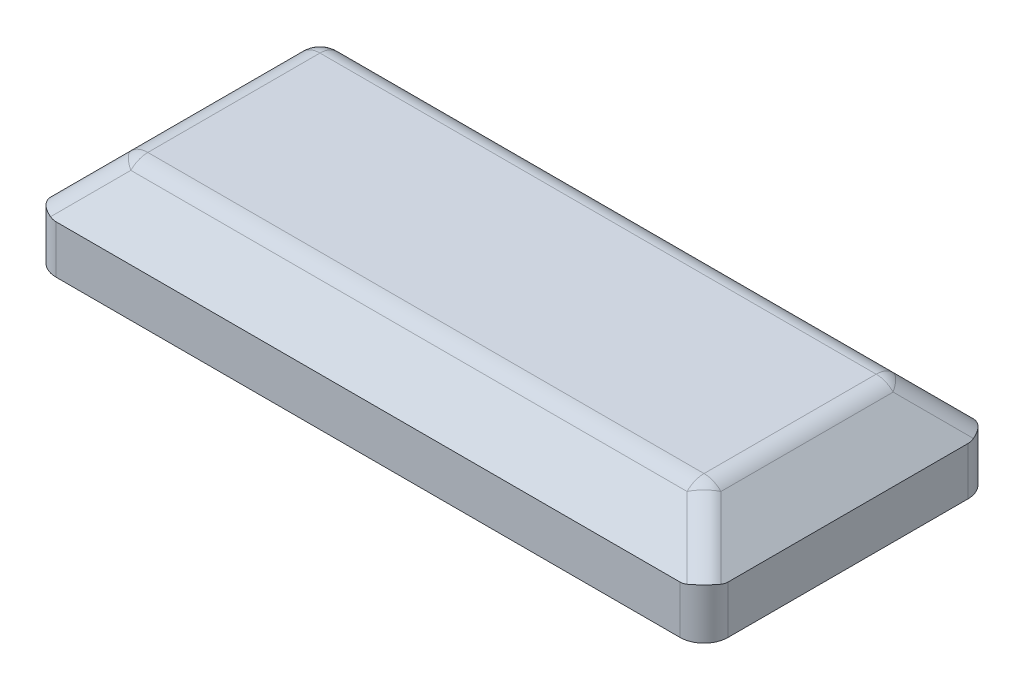
ISO-10303-21;
HEADER;
FILE_DESCRIPTION(('STEP AP214'),'2;1');
FILE_NAME('part.step','',(''),(''),'','','');
FILE_SCHEMA(('AUTOMOTIVE_DESIGN { 1 0 10303 214 1 1 1 1 }'));
ENDSEC;
DATA;
#1=APPLICATION_CONTEXT('core data for automotive mechanical design processes');
#2=APPLICATION_PROTOCOL_DEFINITION('international standard','automotive_design',2000,#1);
#3=PRODUCT_CONTEXT('',#1,'mechanical');
#4=PRODUCT('Part','Part','',(#3));
#5=PRODUCT_RELATED_PRODUCT_CATEGORY('part','',(#4));
#6=PRODUCT_DEFINITION_FORMATION('','',#4);
#7=PRODUCT_DEFINITION_CONTEXT('part definition',#1,'design');
#8=PRODUCT_DEFINITION('design','',#6,#7);
#9=PRODUCT_DEFINITION_SHAPE('','',#8);
#10=(LENGTH_UNIT() NAMED_UNIT(*) SI_UNIT(.MILLI.,.METRE.));
#11=(NAMED_UNIT(*) PLANE_ANGLE_UNIT() SI_UNIT($,.RADIAN.));
#12=(NAMED_UNIT(*) SI_UNIT($,.STERADIAN.) SOLID_ANGLE_UNIT());
#13=UNCERTAINTY_MEASURE_WITH_UNIT(LENGTH_MEASURE(1.E-05),#10,'distance_accuracy_value','');
#14=(GEOMETRIC_REPRESENTATION_CONTEXT(3) GLOBAL_UNCERTAINTY_ASSIGNED_CONTEXT((#13)) GLOBAL_UNIT_ASSIGNED_CONTEXT((#10,
#11,#12)) REPRESENTATION_CONTEXT('',''));
#15=CARTESIAN_POINT('',(0.,0.,0.));
#16=DIRECTION('',(0.,0.,1.));
#17=DIRECTION('',(1.,0.,0.));
#18=AXIS2_PLACEMENT_3D('',#15,#16,#17);
#19=CARTESIAN_POINT('',(70.,10.,30.));
#20=DIRECTION('',(-1.,0.,0.));
#21=DIRECTION('',(0.,0.,1.));
#22=AXIS2_PLACEMENT_3D('',#19,#20,#21);
#23=PLANE('',#22);
#24=DIRECTION('',(0.,0.,-1.));
#25=VECTOR('',#24,1.);
#26=CARTESIAN_POINT('',(70.,0.,30.));
#27=LINE('',#26,#25);
#28=CARTESIAN_POINT('',(70.,0.,25.));
#29=VERTEX_POINT('',#28);
#30=CARTESIAN_POINT('',(70.,0.,-25.));
#31=VERTEX_POINT('',#30);
#32=EDGE_CURVE('E298',#29,#31,#27,.T.);
#33=ORIENTED_EDGE('',*,*,#32,.T.);
#34=DIRECTION('',(0.,-1.,0.));
#35=VECTOR('',#34,1.);
#36=CARTESIAN_POINT('',(70.,10.,-25.));
#37=LINE('',#36,#35);
#38=CARTESIAN_POINT('',(70.,10.,-25.));
#39=VERTEX_POINT('',#38);
#40=EDGE_CURVE('E260',#31,#39,#37,.F.);
#41=ORIENTED_EDGE('',*,*,#40,.T.);
#42=DIRECTION('',(0.,0.,-1.));
#43=VECTOR('',#42,1.);
#44=CARTESIAN_POINT('',(70.,10.,30.));
#45=LINE('',#44,#43);
#46=CARTESIAN_POINT('',(70.,10.,25.));
#47=VERTEX_POINT('',#46);
#48=EDGE_CURVE('E318',#47,#39,#45,.T.);
#49=ORIENTED_EDGE('',*,*,#48,.F.);
#50=DIRECTION('',(0.,-1.,0.));
#51=VECTOR('',#50,1.);
#52=CARTESIAN_POINT('',(70.,10.,25.));
#53=LINE('',#52,#51);
#54=EDGE_CURVE('E258',#47,#29,#53,.T.);
#55=ORIENTED_EDGE('',*,*,#54,.T.);
#56=EDGE_LOOP('',(#33,#41,#49,#55));
#57=FACE_BOUND('',#56,.T.);
#58=ADVANCED_FACE('F37',(#57),#23,.F.);
#59=CARTESIAN_POINT('',(-70.,10.,-30.));
#60=DIRECTION('',(0.,0.,1.));
#61=DIRECTION('',(1.,0.,0.));
#62=AXIS2_PLACEMENT_3D('',#59,#60,#61);
#63=PLANE('',#62);
#64=DIRECTION('',(-1.,0.,0.));
#65=VECTOR('',#64,1.);
#66=CARTESIAN_POINT('',(-70.,0.,-30.));
#67=LINE('',#66,#65);
#68=CARTESIAN_POINT('',(65.,0.,-30.));
#69=VERTEX_POINT('',#68);
#70=CARTESIAN_POINT('',(-65.,0.,-30.));
#71=VERTEX_POINT('',#70);
#72=EDGE_CURVE('E304',#69,#71,#67,.T.);
#73=ORIENTED_EDGE('',*,*,#72,.T.);
#74=DIRECTION('',(0.,-1.,0.));
#75=VECTOR('',#74,1.);
#76=CARTESIAN_POINT('',(-65.,10.,-30.));
#77=LINE('',#76,#75);
#78=CARTESIAN_POINT('',(-65.,10.,-30.));
#79=VERTEX_POINT('',#78);
#80=EDGE_CURVE('E256',#71,#79,#77,.F.);
#81=ORIENTED_EDGE('',*,*,#80,.T.);
#82=DIRECTION('',(-1.,0.,0.));
#83=VECTOR('',#82,1.);
#84=CARTESIAN_POINT('',(-70.,10.,-30.));
#85=LINE('',#84,#83);
#86=CARTESIAN_POINT('',(65.,10.,-30.));
#87=VERTEX_POINT('',#86);
#88=EDGE_CURVE('E372',#87,#79,#85,.T.);
#89=ORIENTED_EDGE('',*,*,#88,.F.);
#90=DIRECTION('',(0.,-1.,0.));
#91=VECTOR('',#90,1.);
#92=CARTESIAN_POINT('',(65.,10.,-30.));
#93=LINE('',#92,#91);
#94=EDGE_CURVE('E61',#87,#69,#93,.T.);
#95=ORIENTED_EDGE('',*,*,#94,.T.);
#96=EDGE_LOOP('',(#73,#81,#89,#95));
#97=FACE_BOUND('',#96,.T.);
#98=ADVANCED_FACE('F400',(#97),#63,.F.);
#99=CARTESIAN_POINT('',(-70.,10.,30.));
#100=DIRECTION('',(1.,0.,0.));
#101=DIRECTION('',(0.,0.,-1.));
#102=AXIS2_PLACEMENT_3D('',#99,#100,#101);
#103=PLANE('',#102);
#104=DIRECTION('',(0.,0.,1.));
#105=VECTOR('',#104,1.);
#106=CARTESIAN_POINT('',(-70.,10.,30.));
#107=LINE('',#106,#105);
#108=CARTESIAN_POINT('',(-70.,10.,-25.));
#109=VERTEX_POINT('',#108);
#110=CARTESIAN_POINT('',(-70.,10.,25.));
#111=VERTEX_POINT('',#110);
#112=EDGE_CURVE('E371',#109,#111,#107,.T.);
#113=ORIENTED_EDGE('',*,*,#112,.F.);
#114=DIRECTION('',(0.,-1.,0.));
#115=VECTOR('',#114,1.);
#116=CARTESIAN_POINT('',(-70.,10.,-25.));
#117=LINE('',#116,#115);
#118=CARTESIAN_POINT('',(-70.,0.,-25.));
#119=VERTEX_POINT('',#118);
#120=EDGE_CURVE('E246',#109,#119,#117,.T.);
#121=ORIENTED_EDGE('',*,*,#120,.T.);
#122=DIRECTION('',(0.,0.,1.));
#123=VECTOR('',#122,1.);
#124=CARTESIAN_POINT('',(-70.,0.,30.));
#125=LINE('',#124,#123);
#126=CARTESIAN_POINT('',(-70.,0.,25.));
#127=VERTEX_POINT('',#126);
#128=EDGE_CURVE('E309',#119,#127,#125,.T.);
#129=ORIENTED_EDGE('',*,*,#128,.T.);
#130=DIRECTION('',(0.,-1.,0.));
#131=VECTOR('',#130,1.);
#132=CARTESIAN_POINT('',(-70.,10.,25.));
#133=LINE('',#132,#131);
#134=EDGE_CURVE('E244',#127,#111,#133,.F.);
#135=ORIENTED_EDGE('',*,*,#134,.T.);
#136=EDGE_LOOP('',(#113,#121,#129,#135));
#137=FACE_BOUND('',#136,.T.);
#138=ADVANCED_FACE('F405',(#137),#103,.F.);
#139=CARTESIAN_POINT('',(-70.,10.,30.));
#140=DIRECTION('',(0.,0.,-1.));
#141=DIRECTION('',(-1.,0.,0.));
#142=AXIS2_PLACEMENT_3D('',#139,#140,#141);
#143=PLANE('',#142);
#144=DIRECTION('',(1.,0.,0.));
#145=VECTOR('',#144,1.);
#146=CARTESIAN_POINT('',(-70.,0.,30.));
#147=LINE('',#146,#145);
#148=CARTESIAN_POINT('',(-65.,0.,30.));
#149=VERTEX_POINT('',#148);
#150=CARTESIAN_POINT('',(65.,0.,30.));
#151=VERTEX_POINT('',#150);
#152=EDGE_CURVE('E316',#149,#151,#147,.T.);
#153=ORIENTED_EDGE('',*,*,#152,.T.);
#154=DIRECTION('',(0.,-1.,0.));
#155=VECTOR('',#154,1.);
#156=CARTESIAN_POINT('',(65.,10.,30.));
#157=LINE('',#156,#155);
#158=CARTESIAN_POINT('',(65.,10.,30.));
#159=VERTEX_POINT('',#158);
#160=EDGE_CURVE('E11',#151,#159,#157,.F.);
#161=ORIENTED_EDGE('',*,*,#160,.T.);
#162=DIRECTION('',(1.,0.,0.));
#163=VECTOR('',#162,1.);
#164=CARTESIAN_POINT('',(-70.,10.,30.));
#165=LINE('',#164,#163);
#166=CARTESIAN_POINT('',(-65.,10.,30.));
#167=VERTEX_POINT('',#166);
#168=EDGE_CURVE('E195',#167,#159,#165,.T.);
#169=ORIENTED_EDGE('',*,*,#168,.F.);
#170=DIRECTION('',(0.,-1.,0.));
#171=VECTOR('',#170,1.);
#172=CARTESIAN_POINT('',(-65.,10.,30.));
#173=LINE('',#172,#171);
#174=EDGE_CURVE('E46',#167,#149,#173,.T.);
#175=ORIENTED_EDGE('',*,*,#174,.T.);
#176=EDGE_LOOP('',(#153,#161,#169,#175));
#177=FACE_BOUND('',#176,.T.);
#178=ADVANCED_FACE('F362',(#177),#143,.F.);
#179=CARTESIAN_POINT('',(0.,0.,0.));
#180=DIRECTION('',(0.,-1.,0.));
#181=DIRECTION('',(0.,0.,-1.));
#182=AXIS2_PLACEMENT_3D('',#179,#180,#181);
#183=PLANE('',#182);
#184=ORIENTED_EDGE('',*,*,#128,.F.);
#185=CARTESIAN_POINT('',(-65.,0.,-25.));
#186=DIRECTION('',(0.,-1.,0.));
#187=DIRECTION('',(0.,0.,-1.));
#188=AXIS2_PLACEMENT_3D('',#185,#186,#187);
#189=CIRCLE('',#188,5.);
#190=EDGE_CURVE('E54',#119,#71,#189,.T.);
#191=ORIENTED_EDGE('',*,*,#190,.T.);
#192=ORIENTED_EDGE('',*,*,#72,.F.);
#193=CARTESIAN_POINT('',(65.,0.,-25.));
#194=DIRECTION('',(0.,-1.,0.));
#195=DIRECTION('',(0.,0.,-1.));
#196=AXIS2_PLACEMENT_3D('',#193,#194,#195);
#197=CIRCLE('',#196,5.);
#198=EDGE_CURVE('E252',#69,#31,#197,.T.);
#199=ORIENTED_EDGE('',*,*,#198,.T.);
#200=ORIENTED_EDGE('',*,*,#32,.F.);
#201=CARTESIAN_POINT('',(65.,0.,25.));
#202=DIRECTION('',(0.,-1.,0.));
#203=DIRECTION('',(0.,0.,-1.));
#204=AXIS2_PLACEMENT_3D('',#201,#202,#203);
#205=CIRCLE('',#204,5.);
#206=EDGE_CURVE('E250',#29,#151,#205,.T.);
#207=ORIENTED_EDGE('',*,*,#206,.T.);
#208=ORIENTED_EDGE('',*,*,#152,.F.);
#209=CARTESIAN_POINT('',(-65.,0.,25.));
#210=DIRECTION('',(0.,-1.,0.));
#211=DIRECTION('',(0.,0.,-1.));
#212=AXIS2_PLACEMENT_3D('',#209,#210,#211);
#213=CIRCLE('',#212,5.);
#214=EDGE_CURVE('E248',#149,#127,#213,.T.);
#215=ORIENTED_EDGE('',*,*,#214,.T.);
#216=EDGE_LOOP('',(#184,#191,#192,#199,#200,#207,#208,#215));
#217=FACE_BOUND('',#216,.T.);
#218=ADVANCED_FACE('F364',(#217),#183,.T.);
#219=CARTESIAN_POINT('',(-70.,10.,30.));
#220=DIRECTION('',(0.,0.707106781186549,0.707106781186546));
#221=DIRECTION('',(0.,-0.707106781186546,0.707106781186549));
#222=AXIS2_PLACEMENT_3D('',#219,#220,#221);
#223=PLANE('',#222);
#224=ORIENTED_EDGE('',*,*,#168,.T.);
#225=CARTESIAN_POINT('',(65.,15.,25.));
#226=DIRECTION('',(0.,0.707106781186549,0.707106781186546));
#227=DIRECTION('',(0.,-0.707106781186546,0.707106781186549));
#228=AXIS2_PLACEMENT_3D('',#225,#226,#227);
#229=ELLIPSE('',#228,7.07106781186546,5.);
#230=CARTESIAN_POINT('',(66.2940952255126,10.1703708685547,29.8296291314453));
#231=VERTEX_POINT('',#230);
#232=EDGE_CURVE('E242',#159,#231,#229,.T.);
#233=ORIENTED_EDGE('',*,*,#232,.T.);
#234=DIRECTION('',(-0.577350269189627,0.577350269189624,-0.577350269189627));
#235=VECTOR('',#234,1.);
#236=CARTESIAN_POINT('',(20.9763107293781,55.488155364689,-15.4881553646892));
#237=LINE('',#236,#235);
#238=CARTESIAN_POINT('',(57.9289321881345,18.5355339059327,21.4644660940672));
#239=VERTEX_POINT('',#238);
#240=EDGE_CURVE('E240',#231,#239,#237,.T.);
#241=ORIENTED_EDGE('',*,*,#240,.T.);
#242=DIRECTION('',(1.,0.,0.));
#243=VECTOR('',#242,1.);
#244=CARTESIAN_POINT('',(-60.,18.5355339059327,21.4644660940672));
#245=LINE('',#244,#243);
#246=CARTESIAN_POINT('',(-57.9289321881345,18.5355339059327,21.4644660940672));
#247=VERTEX_POINT('',#246);
#248=EDGE_CURVE('E238',#239,#247,#245,.F.);
#249=ORIENTED_EDGE('',*,*,#248,.T.);
#250=DIRECTION('',(0.577350269189627,0.577350269189624,-0.577350269189627));
#251=VECTOR('',#250,1.);
#252=CARTESIAN_POINT('',(-67.6429773960449,8.82148869802242,31.1785113019776));
#253=LINE('',#252,#251);
#254=CARTESIAN_POINT('',(-66.2940952255126,10.1703708685547,29.8296291314453));
#255=VERTEX_POINT('',#254);
#256=EDGE_CURVE('E234',#247,#255,#253,.F.);
#257=ORIENTED_EDGE('',*,*,#256,.T.);
#258=CARTESIAN_POINT('',(-65.,15.,25.));
#259=DIRECTION('',(0.,0.707106781186549,0.707106781186546));
#260=DIRECTION('',(0.,-0.707106781186546,0.707106781186549));
#261=AXIS2_PLACEMENT_3D('',#258,#259,#260);
#262=ELLIPSE('',#261,7.07106781186546,5.);
#263=EDGE_CURVE('E236',#255,#167,#262,.T.);
#264=ORIENTED_EDGE('',*,*,#263,.T.);
#265=EDGE_LOOP('',(#224,#233,#241,#249,#257,#264));
#266=FACE_BOUND('',#265,.T.);
#267=ADVANCED_FACE('F353',(#266),#223,.T.);
#268=CARTESIAN_POINT('',(70.,10.,30.));
#269=DIRECTION('',(0.707106781186546,0.707106781186549,0.));
#270=DIRECTION('',(-0.707106781186549,0.707106781186546,0.));
#271=AXIS2_PLACEMENT_3D('',#268,#269,#270);
#272=PLANE('',#271);
#273=ORIENTED_EDGE('',*,*,#48,.T.);
#274=CARTESIAN_POINT('',(65.,15.,-25.));
#275=DIRECTION('',(0.707106781186546,0.707106781186549,0.));
#276=DIRECTION('',(0.707106781186549,-0.707106781186546,0.));
#277=AXIS2_PLACEMENT_3D('',#274,#275,#276);
#278=ELLIPSE('',#277,7.07106781186546,5.);
#279=CARTESIAN_POINT('',(69.8296291314453,10.1703708685547,-26.2940952255126));
#280=VERTEX_POINT('',#279);
#281=EDGE_CURVE('E232',#39,#280,#278,.T.);
#282=ORIENTED_EDGE('',*,*,#281,.T.);
#283=DIRECTION('',(-0.577350269189627,0.577350269189624,0.577350269189627));
#284=VECTOR('',#283,1.);
#285=CARTESIAN_POINT('',(51.1785113019775,28.8214886980224,-7.6429773960448));
#286=LINE('',#285,#284);
#287=CARTESIAN_POINT('',(61.4644660940672,18.5355339059327,-17.9289321881345));
#288=VERTEX_POINT('',#287);
#289=EDGE_CURVE('E230',#280,#288,#286,.T.);
#290=ORIENTED_EDGE('',*,*,#289,.T.);
#291=DIRECTION('',(0.,0.,-1.));
#292=VECTOR('',#291,1.);
#293=CARTESIAN_POINT('',(61.4644660940672,18.5355339059327,20.));
#294=LINE('',#293,#292);
#295=CARTESIAN_POINT('',(61.4644660940672,18.5355339059327,17.9289321881345));
#296=VERTEX_POINT('',#295);
#297=EDGE_CURVE('E228',#288,#296,#294,.F.);
#298=ORIENTED_EDGE('',*,*,#297,.T.);
#299=DIRECTION('',(-0.577350269189627,0.577350269189624,-0.577350269189627));
#300=VECTOR('',#299,1.);
#301=CARTESIAN_POINT('',(71.1785113019776,8.82148869802242,27.6429773960448));
#302=LINE('',#301,#300);
#303=CARTESIAN_POINT('',(69.8296291314453,10.1703708685547,26.2940952255126));
#304=VERTEX_POINT('',#303);
#305=EDGE_CURVE('E226',#296,#304,#302,.F.);
#306=ORIENTED_EDGE('',*,*,#305,.T.);
#307=CARTESIAN_POINT('',(65.,15.,25.));
#308=DIRECTION('',(0.707106781186546,0.707106781186549,0.));
#309=DIRECTION('',(0.707106781186549,-0.707106781186546,0.));
#310=AXIS2_PLACEMENT_3D('',#307,#308,#309);
#311=ELLIPSE('',#310,7.07106781186546,5.);
#312=EDGE_CURVE('E224',#304,#47,#311,.T.);
#313=ORIENTED_EDGE('',*,*,#312,.T.);
#314=EDGE_LOOP('',(#273,#282,#290,#298,#306,#313));
#315=FACE_BOUND('',#314,.T.);
#316=ADVANCED_FACE('F381',(#315),#272,.T.);
#317=CARTESIAN_POINT('',(70.,10.,-30.));
#318=DIRECTION('',(0.,0.707106781186549,-0.707106781186546));
#319=DIRECTION('',(0.,0.707106781186546,0.707106781186549));
#320=AXIS2_PLACEMENT_3D('',#317,#318,#319);
#321=PLANE('',#320);
#322=ORIENTED_EDGE('',*,*,#88,.T.);
#323=CARTESIAN_POINT('',(-65.,15.,-25.));
#324=DIRECTION('',(0.,0.707106781186549,-0.707106781186546));
#325=DIRECTION('',(0.,-0.707106781186546,-0.707106781186549));
#326=AXIS2_PLACEMENT_3D('',#323,#324,#325);
#327=ELLIPSE('',#326,7.07106781186546,5.);
#328=CARTESIAN_POINT('',(-66.2940952255126,10.1703708685547,-29.8296291314453));
#329=VERTEX_POINT('',#328);
#330=EDGE_CURVE('E222',#79,#329,#327,.T.);
#331=ORIENTED_EDGE('',*,*,#330,.T.);
#332=DIRECTION('',(0.577350269189627,0.577350269189624,0.577350269189627));
#333=VECTOR('',#332,1.);
#334=CARTESIAN_POINT('',(-20.9763107293781,55.488155364689,15.4881553646892));
#335=LINE('',#334,#333);
#336=CARTESIAN_POINT('',(-57.9289321881345,18.5355339059327,-21.4644660940672));
#337=VERTEX_POINT('',#336);
#338=EDGE_CURVE('E220',#329,#337,#335,.T.);
#339=ORIENTED_EDGE('',*,*,#338,.T.);
#340=DIRECTION('',(-1.,0.,0.));
#341=VECTOR('',#340,1.);
#342=CARTESIAN_POINT('',(60.,18.5355339059327,-21.4644660940672));
#343=LINE('',#342,#341);
#344=CARTESIAN_POINT('',(57.9289321881345,18.5355339059327,-21.4644660940672));
#345=VERTEX_POINT('',#344);
#346=EDGE_CURVE('E218',#337,#345,#343,.F.);
#347=ORIENTED_EDGE('',*,*,#346,.T.);
#348=DIRECTION('',(-0.577350269189627,0.577350269189624,0.577350269189627));
#349=VECTOR('',#348,1.);
#350=CARTESIAN_POINT('',(67.6429773960449,8.82148869802242,-31.1785113019776));
#351=LINE('',#350,#349);
#352=CARTESIAN_POINT('',(66.2940952255126,10.1703708685547,-29.8296291314453));
#353=VERTEX_POINT('',#352);
#354=EDGE_CURVE('E216',#345,#353,#351,.F.);
#355=ORIENTED_EDGE('',*,*,#354,.T.);
#356=CARTESIAN_POINT('',(65.,15.,-25.));
#357=DIRECTION('',(0.,0.707106781186549,-0.707106781186546));
#358=DIRECTION('',(0.,-0.707106781186546,-0.707106781186549));
#359=AXIS2_PLACEMENT_3D('',#356,#357,#358);
#360=ELLIPSE('',#359,7.07106781186546,5.);
#361=EDGE_CURVE('E214',#353,#87,#360,.T.);
#362=ORIENTED_EDGE('',*,*,#361,.T.);
#363=EDGE_LOOP('',(#322,#331,#339,#347,#355,#362));
#364=FACE_BOUND('',#363,.T.);
#365=ADVANCED_FACE('F568',(#364),#321,.T.);
#366=CARTESIAN_POINT('',(-70.,10.,-30.));
#367=DIRECTION('',(-0.707106781186546,0.707106781186549,0.));
#368=DIRECTION('',(-0.707106781186549,-0.707106781186546,0.));
#369=AXIS2_PLACEMENT_3D('',#366,#367,#368);
#370=PLANE('',#369);
#371=DIRECTION('',(0.577350269189627,0.577350269189624,0.577350269189627));
#372=VECTOR('',#371,1.);
#373=CARTESIAN_POINT('',(-71.1785113019776,8.82148869802242,-27.6429773960448));
#374=LINE('',#373,#372);
#375=CARTESIAN_POINT('',(-61.4644660940672,18.5355339059327,-17.9289321881345));
#376=VERTEX_POINT('',#375);
#377=CARTESIAN_POINT('',(-69.8296291314453,10.1703708685547,-26.2940952255126));
#378=VERTEX_POINT('',#377);
#379=EDGE_CURVE('E210',#376,#378,#374,.F.);
#380=ORIENTED_EDGE('',*,*,#379,.T.);
#381=CARTESIAN_POINT('',(-65.,15.,-25.));
#382=DIRECTION('',(-0.707106781186546,0.707106781186549,0.));
#383=DIRECTION('',(-0.707106781186549,-0.707106781186546,0.));
#384=AXIS2_PLACEMENT_3D('',#381,#382,#383);
#385=ELLIPSE('',#384,7.07106781186546,5.);
#386=EDGE_CURVE('E212',#378,#109,#385,.T.);
#387=ORIENTED_EDGE('',*,*,#386,.T.);
#388=ORIENTED_EDGE('',*,*,#112,.T.);
#389=CARTESIAN_POINT('',(-65.,15.,25.));
#390=DIRECTION('',(-0.707106781186546,0.707106781186549,0.));
#391=DIRECTION('',(-0.707106781186549,-0.707106781186546,0.));
#392=AXIS2_PLACEMENT_3D('',#389,#390,#391);
#393=ELLIPSE('',#392,7.07106781186546,5.);
#394=CARTESIAN_POINT('',(-69.8296291314453,10.1703708685547,26.2940952255126));
#395=VERTEX_POINT('',#394);
#396=EDGE_CURVE('E203',#111,#395,#393,.T.);
#397=ORIENTED_EDGE('',*,*,#396,.T.);
#398=DIRECTION('',(0.577350269189627,0.577350269189624,-0.577350269189627));
#399=VECTOR('',#398,1.);
#400=CARTESIAN_POINT('',(-51.1785113019775,28.8214886980224,7.64297739604479));
#401=LINE('',#400,#399);
#402=CARTESIAN_POINT('',(-61.4644660940672,18.5355339059327,17.9289321881345));
#403=VERTEX_POINT('',#402);
#404=EDGE_CURVE('E201',#395,#403,#401,.T.);
#405=ORIENTED_EDGE('',*,*,#404,.T.);
#406=DIRECTION('',(0.,0.,1.));
#407=VECTOR('',#406,1.);
#408=CARTESIAN_POINT('',(-61.4644660940672,18.5355339059327,-20.));
#409=LINE('',#408,#407);
#410=EDGE_CURVE('E172',#403,#376,#409,.F.);
#411=ORIENTED_EDGE('',*,*,#410,.T.);
#412=EDGE_LOOP('',(#380,#387,#388,#397,#405,#411));
#413=FACE_BOUND('',#412,.T.);
#414=ADVANCED_FACE('F342',(#413),#370,.T.);
#415=CARTESIAN_POINT('',(0.,20.,0.));
#416=DIRECTION('',(0.,1.,0.));
#417=DIRECTION('',(0.,0.,1.));
#418=AXIS2_PLACEMENT_3D('',#415,#416,#417);
#419=PLANE('',#418);
#420=DIRECTION('',(1.,0.,0.));
#421=VECTOR('',#420,1.);
#422=CARTESIAN_POINT('',(-60.,20.,-17.9289321881345));
#423=LINE('',#422,#421);
#424=CARTESIAN_POINT('',(57.9289321881345,20.,-17.9289321881345));
#425=VERTEX_POINT('',#424);
#426=CARTESIAN_POINT('',(-57.9289321881345,20.,-17.9289321881345));
#427=VERTEX_POINT('',#426);
#428=EDGE_CURVE('E199',#425,#427,#423,.F.);
#429=ORIENTED_EDGE('',*,*,#428,.T.);
#430=DIRECTION('',(0.,0.,-1.));
#431=VECTOR('',#430,1.);
#432=CARTESIAN_POINT('',(-57.9289321881345,20.,20.));
#433=LINE('',#432,#431);
#434=CARTESIAN_POINT('',(-57.9289321881345,20.,17.9289321881345));
#435=VERTEX_POINT('',#434);
#436=EDGE_CURVE('E170',#427,#435,#433,.F.);
#437=ORIENTED_EDGE('',*,*,#436,.T.);
#438=DIRECTION('',(-1.,0.,0.));
#439=VECTOR('',#438,1.);
#440=CARTESIAN_POINT('',(60.,20.,17.9289321881345));
#441=LINE('',#440,#439);
#442=CARTESIAN_POINT('',(57.9289321881345,20.,17.9289321881345));
#443=VERTEX_POINT('',#442);
#444=EDGE_CURVE('E188',#435,#443,#441,.F.);
#445=ORIENTED_EDGE('',*,*,#444,.T.);
#446=DIRECTION('',(0.,0.,1.));
#447=VECTOR('',#446,1.);
#448=CARTESIAN_POINT('',(57.9289321881345,20.,-20.));
#449=LINE('',#448,#447);
#450=EDGE_CURVE('E194',#443,#425,#449,.F.);
#451=ORIENTED_EDGE('',*,*,#450,.T.);
#452=EDGE_LOOP('',(#429,#437,#445,#451));
#453=FACE_BOUND('',#452,.T.);
#454=ADVANCED_FACE('F197',(#453),#419,.T.);
#455=CARTESIAN_POINT('',(65.,10.,-25.));
#456=DIRECTION('',(0.,-1.,0.));
#457=DIRECTION('',(0.,0.,-1.));
#458=AXIS2_PLACEMENT_3D('',#455,#456,#457);
#459=CYLINDRICAL_SURFACE('',#458,5.);
#460=ORIENTED_EDGE('',*,*,#94,.F.);
#461=ORIENTED_EDGE('',*,*,#361,.F.);
#462=CARTESIAN_POINT('',(65.,7.92893218813453,-25.));
#463=DIRECTION('',(0.325057583671869,-0.888073833977115,-0.325057583671869));
#464=DIRECTION('',(-0.627963030199554,-0.459700843380984,0.627963030199554));
#465=AXIS2_PLACEMENT_3D('',#462,#463,#464);
#466=ELLIPSE('',#465,5.63016250305247,5.);
#467=EDGE_CURVE('E41',#280,#353,#466,.F.);
#468=ORIENTED_EDGE('',*,*,#467,.F.);
#469=ORIENTED_EDGE('',*,*,#281,.F.);
#470=ORIENTED_EDGE('',*,*,#40,.F.);
#471=ORIENTED_EDGE('',*,*,#198,.F.);
#472=EDGE_LOOP('',(#460,#461,#468,#469,#470,#471));
#473=FACE_BOUND('',#472,.T.);
#474=ADVANCED_FACE('F39',(#473),#459,.T.);
#475=CARTESIAN_POINT('',(65.,10.,25.));
#476=DIRECTION('',(0.,-1.,0.));
#477=DIRECTION('',(0.,0.,-1.));
#478=AXIS2_PLACEMENT_3D('',#475,#476,#477);
#479=CYLINDRICAL_SURFACE('',#478,5.);
#480=ORIENTED_EDGE('',*,*,#54,.F.);
#481=ORIENTED_EDGE('',*,*,#312,.F.);
#482=CARTESIAN_POINT('',(65.,7.92893218813452,25.));
#483=DIRECTION('',(0.325057583671869,-0.888073833977115,0.325057583671869));
#484=DIRECTION('',(-0.627963030199554,-0.459700843380984,-0.627963030199554));
#485=AXIS2_PLACEMENT_3D('',#482,#483,#484);
#486=ELLIPSE('',#485,5.63016250305247,5.);
#487=EDGE_CURVE('E291',#231,#304,#486,.F.);
#488=ORIENTED_EDGE('',*,*,#487,.F.);
#489=ORIENTED_EDGE('',*,*,#232,.F.);
#490=ORIENTED_EDGE('',*,*,#160,.F.);
#491=ORIENTED_EDGE('',*,*,#206,.F.);
#492=EDGE_LOOP('',(#480,#481,#488,#489,#490,#491));
#493=FACE_BOUND('',#492,.T.);
#494=ADVANCED_FACE('F368',(#493),#479,.T.);
#495=CARTESIAN_POINT('',(67.6429773960449,5.28595479208968,-27.6429773960448));
#496=DIRECTION('',(0.577350269189627,-0.577350269189624,-0.577350269189627));
#497=DIRECTION('',(-0.707106781186547,0.,-0.707106781186547));
#498=AXIS2_PLACEMENT_3D('',#495,#496,#497);
#499=CYLINDRICAL_SURFACE('',#498,5.);
#500=ORIENTED_EDGE('',*,*,#467,.T.);
#501=ORIENTED_EDGE('',*,*,#354,.F.);
#502=CARTESIAN_POINT('',(57.9289321881345,15.,-17.9289321881345));
#503=DIRECTION('',(-0.577350269189626,0.577350269189624,0.577350269189627));
#504=DIRECTION('',(0.707106781186548,0.,0.707106781186547));
#505=AXIS2_PLACEMENT_3D('',#502,#503,#504);
#506=CIRCLE('',#505,5.);
#507=EDGE_CURVE('E289',#288,#345,#506,.T.);
#508=ORIENTED_EDGE('',*,*,#507,.F.);
#509=ORIENTED_EDGE('',*,*,#289,.F.);
#510=EDGE_LOOP('',(#500,#501,#508,#509));
#511=FACE_BOUND('',#510,.T.);
#512=ADVANCED_FACE('F385',(#511),#499,.T.);
#513=CARTESIAN_POINT('',(57.9289321881345,15.,0.));
#514=DIRECTION('',(0.,0.,-1.));
#515=DIRECTION('',(-1.,0.,0.));
#516=AXIS2_PLACEMENT_3D('',#513,#514,#515);
#517=CYLINDRICAL_SURFACE('',#516,5.);
#518=CARTESIAN_POINT('',(57.9289321881345,15.,17.9289321881345));
#519=DIRECTION('',(0.,0.,1.));
#520=DIRECTION('',(1.,0.,0.));
#521=AXIS2_PLACEMENT_3D('',#518,#519,#520);
#522=CIRCLE('',#521,5.);
#523=EDGE_CURVE('E283',#296,#443,#522,.T.);
#524=ORIENTED_EDGE('',*,*,#523,.F.);
#525=ORIENTED_EDGE('',*,*,#297,.F.);
#526=CARTESIAN_POINT('',(57.9289321881345,15.,-17.9289321881345));
#527=DIRECTION('',(0.,0.,-1.));
#528=DIRECTION('',(-1.,0.,0.));
#529=AXIS2_PLACEMENT_3D('',#526,#527,#528);
#530=CIRCLE('',#529,5.);
#531=EDGE_CURVE('E286',#425,#288,#530,.T.);
#532=ORIENTED_EDGE('',*,*,#531,.F.);
#533=ORIENTED_EDGE('',*,*,#450,.F.);
#534=EDGE_LOOP('',(#524,#525,#532,#533));
#535=FACE_BOUND('',#534,.T.);
#536=ADVANCED_FACE('F324',(#535),#517,.T.);
#537=CARTESIAN_POINT('',(67.6429773960449,5.28595479208968,27.6429773960448));
#538=DIRECTION('',(0.577350269189627,-0.577350269189624,0.577350269189627));
#539=DIRECTION('',(0.707106781186547,0.,-0.707106781186547));
#540=AXIS2_PLACEMENT_3D('',#537,#538,#539);
#541=CYLINDRICAL_SURFACE('',#540,5.);
#542=ORIENTED_EDGE('',*,*,#487,.T.);
#543=ORIENTED_EDGE('',*,*,#305,.F.);
#544=CARTESIAN_POINT('',(57.9289321881345,15.,17.9289321881345));
#545=DIRECTION('',(-0.577350269189626,0.577350269189625,-0.577350269189627));
#546=DIRECTION('',(-0.707106781186548,0.,0.707106781186547));
#547=AXIS2_PLACEMENT_3D('',#544,#545,#546);
#548=CIRCLE('',#547,5.);
#549=EDGE_CURVE('E280',#239,#296,#548,.T.);
#550=ORIENTED_EDGE('',*,*,#549,.F.);
#551=ORIENTED_EDGE('',*,*,#240,.F.);
#552=EDGE_LOOP('',(#542,#543,#550,#551));
#553=FACE_BOUND('',#552,.T.);
#554=ADVANCED_FACE('F387',(#553),#541,.T.);
#555=CARTESIAN_POINT('',(-65.,10.,-25.));
#556=DIRECTION('',(0.,-1.,0.));
#557=DIRECTION('',(0.,0.,-1.));
#558=AXIS2_PLACEMENT_3D('',#555,#556,#557);
#559=CYLINDRICAL_SURFACE('',#558,5.);
#560=ORIENTED_EDGE('',*,*,#120,.F.);
#561=ORIENTED_EDGE('',*,*,#386,.F.);
#562=CARTESIAN_POINT('',(-65.,7.92893218813453,-25.));
#563=DIRECTION('',(-0.325057583671869,-0.888073833977115,-0.325057583671869));
#564=DIRECTION('',(0.627963030199554,-0.459700843380984,0.627963030199554));
#565=AXIS2_PLACEMENT_3D('',#562,#563,#564);
#566=ELLIPSE('',#565,5.63016250305247,5.);
#567=EDGE_CURVE('E277',#329,#378,#566,.F.);
#568=ORIENTED_EDGE('',*,*,#567,.F.);
#569=ORIENTED_EDGE('',*,*,#330,.F.);
#570=ORIENTED_EDGE('',*,*,#80,.F.);
#571=ORIENTED_EDGE('',*,*,#190,.F.);
#572=EDGE_LOOP('',(#560,#561,#568,#569,#570,#571));
#573=FACE_BOUND('',#572,.T.);
#574=ADVANCED_FACE('F397',(#573),#559,.T.);
#575=CARTESIAN_POINT('',(57.9289321881345,15.,-17.9289321881345));
#576=DIRECTION('',(0.,1.,0.));
#577=DIRECTION('',(-1.,0.,0.));
#578=AXIS2_PLACEMENT_3D('',#575,#576,#577);
#579=SPHERICAL_SURFACE('',#578,5.);
#580=ORIENTED_EDGE('',*,*,#531,.T.);
#581=ORIENTED_EDGE('',*,*,#507,.T.);
#582=CARTESIAN_POINT('',(57.9289321881345,15.,-17.9289321881345));
#583=DIRECTION('',(1.,0.,0.));
#584=DIRECTION('',(0.,0.,-1.));
#585=AXIS2_PLACEMENT_3D('',#582,#583,#584);
#586=CIRCLE('',#585,5.);
#587=EDGE_CURVE('E274',#425,#345,#586,.F.);
#588=ORIENTED_EDGE('',*,*,#587,.F.);
#589=EDGE_LOOP('',(#580,#581,#588));
#590=FACE_BOUND('',#589,.T.);
#591=ADVANCED_FACE('F327',(#590),#579,.T.);
#592=CARTESIAN_POINT('',(57.9289321881345,15.,17.9289321881345));
#593=DIRECTION('',(0.,1.,0.));
#594=DIRECTION('',(-1.,0.,0.));
#595=AXIS2_PLACEMENT_3D('',#592,#593,#594);
#596=SPHERICAL_SURFACE('',#595,5.);
#597=ORIENTED_EDGE('',*,*,#549,.T.);
#598=ORIENTED_EDGE('',*,*,#523,.T.);
#599=CARTESIAN_POINT('',(57.9289321881345,15.,17.9289321881345));
#600=DIRECTION('',(1.,0.,0.));
#601=DIRECTION('',(0.,0.,-1.));
#602=AXIS2_PLACEMENT_3D('',#599,#600,#601);
#603=CIRCLE('',#602,5.);
#604=EDGE_CURVE('E191',#239,#443,#603,.F.);
#605=ORIENTED_EDGE('',*,*,#604,.F.);
#606=EDGE_LOOP('',(#597,#598,#605));
#607=FACE_BOUND('',#606,.T.);
#608=ADVANCED_FACE('F389',(#607),#596,.T.);
#609=CARTESIAN_POINT('',(-65.,10.,25.));
#610=DIRECTION('',(0.,-1.,0.));
#611=DIRECTION('',(0.,0.,-1.));
#612=AXIS2_PLACEMENT_3D('',#609,#610,#611);
#613=CYLINDRICAL_SURFACE('',#612,5.);
#614=ORIENTED_EDGE('',*,*,#174,.F.);
#615=ORIENTED_EDGE('',*,*,#263,.F.);
#616=CARTESIAN_POINT('',(-65.,7.92893218813452,25.));
#617=DIRECTION('',(-0.325057583671869,-0.888073833977115,0.325057583671869));
#618=DIRECTION('',(-0.627963030199554,0.459700843380984,0.627963030199554));
#619=AXIS2_PLACEMENT_3D('',#616,#617,#618);
#620=ELLIPSE('',#619,5.63016250305247,5.);
#621=EDGE_CURVE('E270',#395,#255,#620,.F.);
#622=ORIENTED_EDGE('',*,*,#621,.F.);
#623=ORIENTED_EDGE('',*,*,#396,.F.);
#624=ORIENTED_EDGE('',*,*,#134,.F.);
#625=ORIENTED_EDGE('',*,*,#214,.F.);
#626=EDGE_LOOP('',(#614,#615,#622,#623,#624,#625));
#627=FACE_BOUND('',#626,.T.);
#628=ADVANCED_FACE('F357',(#627),#613,.T.);
#629=CARTESIAN_POINT('',(-67.6429773960449,5.28595479208968,-27.6429773960448));
#630=DIRECTION('',(-0.577350269189627,-0.577350269189624,-0.577350269189627));
#631=DIRECTION('',(-0.707106781186547,0.,0.707106781186547));
#632=AXIS2_PLACEMENT_3D('',#629,#630,#631);
#633=CYLINDRICAL_SURFACE('',#632,5.);
#634=ORIENTED_EDGE('',*,*,#567,.T.);
#635=ORIENTED_EDGE('',*,*,#379,.F.);
#636=CARTESIAN_POINT('',(-57.9289321881345,15.,-17.9289321881345));
#637=DIRECTION('',(0.577350269189626,0.577350269189625,0.577350269189627));
#638=DIRECTION('',(0.707106781186548,0.,-0.707106781186547));
#639=AXIS2_PLACEMENT_3D('',#636,#637,#638);
#640=CIRCLE('',#639,5.);
#641=EDGE_CURVE('E267',#337,#376,#640,.T.);
#642=ORIENTED_EDGE('',*,*,#641,.F.);
#643=ORIENTED_EDGE('',*,*,#338,.F.);
#644=EDGE_LOOP('',(#634,#635,#642,#643));
#645=FACE_BOUND('',#644,.T.);
#646=ADVANCED_FACE('F338',(#645),#633,.T.);
#647=CARTESIAN_POINT('',(0.,15.,-17.9289321881345));
#648=DIRECTION('',(-1.,0.,0.));
#649=DIRECTION('',(0.,0.,1.));
#650=AXIS2_PLACEMENT_3D('',#647,#648,#649);
#651=CYLINDRICAL_SURFACE('',#650,5.);
#652=ORIENTED_EDGE('',*,*,#587,.T.);
#653=ORIENTED_EDGE('',*,*,#346,.F.);
#654=CARTESIAN_POINT('',(-57.9289321881345,15.,-17.9289321881345));
#655=DIRECTION('',(-1.,0.,0.));
#656=DIRECTION('',(0.,0.,1.));
#657=AXIS2_PLACEMENT_3D('',#654,#655,#656);
#658=CIRCLE('',#657,5.);
#659=EDGE_CURVE('E185',#427,#337,#658,.T.);
#660=ORIENTED_EDGE('',*,*,#659,.F.);
#661=ORIENTED_EDGE('',*,*,#428,.F.);
#662=EDGE_LOOP('',(#652,#653,#660,#661));
#663=FACE_BOUND('',#662,.T.);
#664=ADVANCED_FACE('F330',(#663),#651,.T.);
#665=CARTESIAN_POINT('',(0.,15.,17.9289321881345));
#666=DIRECTION('',(1.,0.,0.));
#667=DIRECTION('',(0.,0.,-1.));
#668=AXIS2_PLACEMENT_3D('',#665,#666,#667);
#669=CYLINDRICAL_SURFACE('',#668,5.);
#670=ORIENTED_EDGE('',*,*,#604,.T.);
#671=ORIENTED_EDGE('',*,*,#444,.F.);
#672=CARTESIAN_POINT('',(-57.9289321881345,15.,17.9289321881345));
#673=DIRECTION('',(-1.,0.,0.));
#674=DIRECTION('',(0.,0.,1.));
#675=AXIS2_PLACEMENT_3D('',#672,#673,#674);
#676=CIRCLE('',#675,5.);
#677=EDGE_CURVE('E178',#247,#435,#676,.T.);
#678=ORIENTED_EDGE('',*,*,#677,.F.);
#679=ORIENTED_EDGE('',*,*,#248,.F.);
#680=EDGE_LOOP('',(#670,#671,#678,#679));
#681=FACE_BOUND('',#680,.T.);
#682=ADVANCED_FACE('F189',(#681),#669,.T.);
#683=CARTESIAN_POINT('',(-67.6429773960449,5.28595479208968,27.6429773960448));
#684=DIRECTION('',(-0.577350269189627,-0.577350269189624,0.577350269189627));
#685=DIRECTION('',(0.707106781186547,0.,0.707106781186547));
#686=AXIS2_PLACEMENT_3D('',#683,#684,#685);
#687=CYLINDRICAL_SURFACE('',#686,5.);
#688=ORIENTED_EDGE('',*,*,#621,.T.);
#689=ORIENTED_EDGE('',*,*,#256,.F.);
#690=CARTESIAN_POINT('',(-57.9289321881345,15.,17.9289321881345));
#691=DIRECTION('',(0.577350269189626,0.577350269189624,-0.577350269189626));
#692=DIRECTION('',(-0.707106781186547,0.,-0.707106781186547));
#693=AXIS2_PLACEMENT_3D('',#690,#691,#692);
#694=CIRCLE('',#693,5.);
#695=EDGE_CURVE('E182',#403,#247,#694,.T.);
#696=ORIENTED_EDGE('',*,*,#695,.F.);
#697=ORIENTED_EDGE('',*,*,#404,.F.);
#698=EDGE_LOOP('',(#688,#689,#696,#697));
#699=FACE_BOUND('',#698,.T.);
#700=ADVANCED_FACE('F349',(#699),#687,.T.);
#701=CARTESIAN_POINT('',(-57.9289321881345,15.,-17.9289321881345));
#702=DIRECTION('',(0.,1.,0.));
#703=DIRECTION('',(-1.,0.,0.));
#704=AXIS2_PLACEMENT_3D('',#701,#702,#703);
#705=SPHERICAL_SURFACE('',#704,5.);
#706=ORIENTED_EDGE('',*,*,#659,.T.);
#707=ORIENTED_EDGE('',*,*,#641,.T.);
#708=CARTESIAN_POINT('',(-57.9289321881345,15.,-17.9289321881345));
#709=DIRECTION('',(0.,0.,-1.));
#710=DIRECTION('',(-1.,0.,0.));
#711=AXIS2_PLACEMENT_3D('',#708,#709,#710);
#712=CIRCLE('',#711,5.);
#713=EDGE_CURVE('E175',#427,#376,#712,.F.);
#714=ORIENTED_EDGE('',*,*,#713,.F.);
#715=EDGE_LOOP('',(#706,#707,#714));
#716=FACE_BOUND('',#715,.T.);
#717=ADVANCED_FACE('F334',(#716),#705,.T.);
#718=CARTESIAN_POINT('',(-57.9289321881345,15.,17.9289321881345));
#719=DIRECTION('',(0.,1.,0.));
#720=DIRECTION('',(-1.,0.,0.));
#721=AXIS2_PLACEMENT_3D('',#718,#719,#720);
#722=SPHERICAL_SURFACE('',#721,5.);
#723=ORIENTED_EDGE('',*,*,#695,.T.);
#724=ORIENTED_EDGE('',*,*,#677,.T.);
#725=CARTESIAN_POINT('',(-57.9289321881345,15.,17.9289321881345));
#726=DIRECTION('',(0.,0.,1.));
#727=DIRECTION('',(1.,0.,0.));
#728=AXIS2_PLACEMENT_3D('',#725,#726,#727);
#729=CIRCLE('',#728,5.);
#730=EDGE_CURVE('E166',#403,#435,#729,.F.);
#731=ORIENTED_EDGE('',*,*,#730,.F.);
#732=EDGE_LOOP('',(#723,#724,#731));
#733=FACE_BOUND('',#732,.T.);
#734=ADVANCED_FACE('F180',(#733),#722,.T.);
#735=CARTESIAN_POINT('',(-57.9289321881345,15.,0.));
#736=DIRECTION('',(0.,0.,1.));
#737=DIRECTION('',(1.,0.,0.));
#738=AXIS2_PLACEMENT_3D('',#735,#736,#737);
#739=CYLINDRICAL_SURFACE('',#738,5.);
#740=ORIENTED_EDGE('',*,*,#713,.T.);
#741=ORIENTED_EDGE('',*,*,#410,.F.);
#742=ORIENTED_EDGE('',*,*,#730,.T.);
#743=ORIENTED_EDGE('',*,*,#436,.F.);
#744=EDGE_LOOP('',(#740,#741,#742,#743));
#745=FACE_BOUND('',#744,.T.);
#746=ADVANCED_FACE('F168',(#745),#739,.T.);
#747=CLOSED_SHELL('',(#58,#98,#138,#178,#218,#267,#316,#365,#414,#454,#474,#494,#512,#536,#554,
#574,#591,#608,#628,#646,#664,#682,#700,#717,#734,#746));
#748=MANIFOLD_SOLID_BREP('B2',#747);
#749=ADVANCED_BREP_SHAPE_REPRESENTATION('',(#18,#748),#14);
#750=SHAPE_DEFINITION_REPRESENTATION(#9,#749);
ENDSEC;
END-ISO-10303-21;
